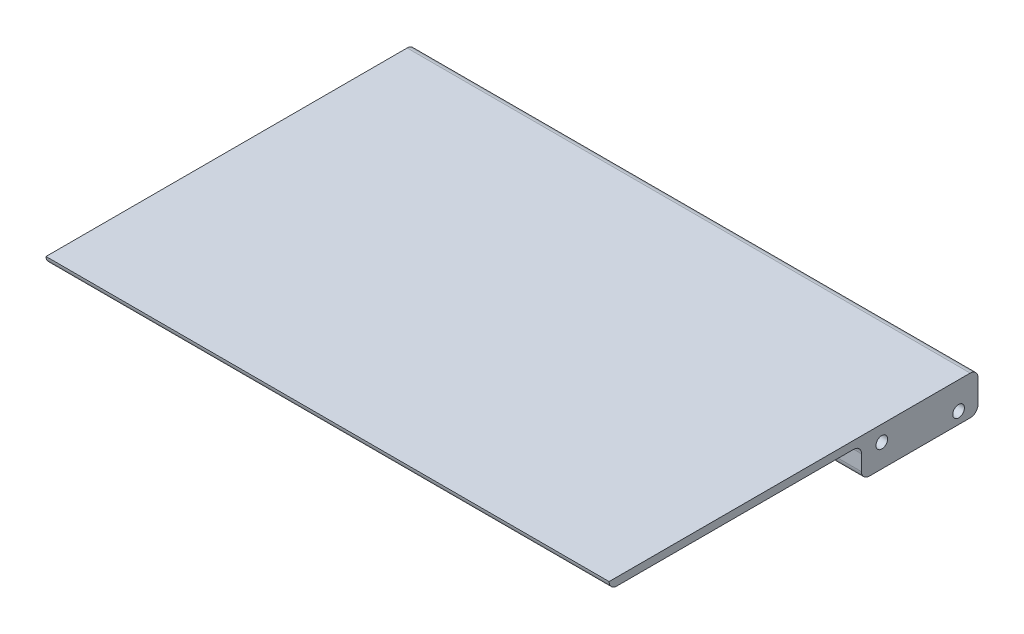
ISO-10303-21;
HEADER;
FILE_DESCRIPTION(('STEP AP214'),'2;1');
FILE_NAME('part.step','',(''),(''),'','','');
FILE_SCHEMA(('AUTOMOTIVE_DESIGN { 1 0 10303 214 1 1 1 1 }'));
ENDSEC;
DATA;
#1=APPLICATION_CONTEXT('core data for automotive mechanical design processes');
#2=APPLICATION_PROTOCOL_DEFINITION('international standard','automotive_design',2000,#1);
#3=PRODUCT_CONTEXT('',#1,'mechanical');
#4=PRODUCT('Part','Part','',(#3));
#5=PRODUCT_RELATED_PRODUCT_CATEGORY('part','',(#4));
#6=PRODUCT_DEFINITION_FORMATION('','',#4);
#7=PRODUCT_DEFINITION_CONTEXT('part definition',#1,'design');
#8=PRODUCT_DEFINITION('design','',#6,#7);
#9=PRODUCT_DEFINITION_SHAPE('','',#8);
#10=(LENGTH_UNIT() NAMED_UNIT(*) SI_UNIT(.MILLI.,.METRE.));
#11=(NAMED_UNIT(*) PLANE_ANGLE_UNIT() SI_UNIT($,.RADIAN.));
#12=(NAMED_UNIT(*) SI_UNIT($,.STERADIAN.) SOLID_ANGLE_UNIT());
#13=UNCERTAINTY_MEASURE_WITH_UNIT(LENGTH_MEASURE(1.E-05),#10,'distance_accuracy_value','');
#14=(GEOMETRIC_REPRESENTATION_CONTEXT(3) GLOBAL_UNCERTAINTY_ASSIGNED_CONTEXT((#13)) GLOBAL_UNIT_ASSIGNED_CONTEXT((#10,
#11,#12)) REPRESENTATION_CONTEXT('',''));
#15=CARTESIAN_POINT('',(0.,0.,0.));
#16=DIRECTION('',(0.,0.,1.));
#17=DIRECTION('',(1.,0.,0.));
#18=AXIS2_PLACEMENT_3D('',#15,#16,#17);
#19=CARTESIAN_POINT('',(72.5,2.,-47.5));
#20=DIRECTION('',(0.,0.,1.));
#21=DIRECTION('',(1.,0.,0.));
#22=AXIS2_PLACEMENT_3D('',#19,#20,#21);
#23=PLANE('',#22);
#24=DIRECTION('',(1.,0.,0.));
#25=VECTOR('',#24,1.);
#26=CARTESIAN_POINT('',(-72.5,-5.99999999999999,-47.5));
#27=LINE('',#26,#25);
#28=CARTESIAN_POINT('',(72.5,-5.99999999999999,-47.5));
#29=VERTEX_POINT('',#28);
#30=CARTESIAN_POINT('',(62.5,-5.99999999999999,-47.5));
#31=VERTEX_POINT('',#30);
#32=EDGE_CURVE('E201',#29,#31,#27,.F.);
#33=ORIENTED_EDGE('',*,*,#32,.T.);
#34=DIRECTION('',(0.,1.,0.));
#35=VECTOR('',#34,1.);
#36=CARTESIAN_POINT('',(62.5,2.,-47.5));
#37=LINE('',#36,#35);
#38=CARTESIAN_POINT('',(62.5,0.,-47.5));
#39=VERTEX_POINT('',#38);
#40=EDGE_CURVE('E248',#31,#39,#37,.T.);
#41=ORIENTED_EDGE('',*,*,#40,.T.);
#42=DIRECTION('',(-1.,0.,0.));
#43=VECTOR('',#42,1.);
#44=CARTESIAN_POINT('',(72.5,0.,-47.5));
#45=LINE('',#44,#43);
#46=CARTESIAN_POINT('',(72.5,0.,-47.5));
#47=VERTEX_POINT('',#46);
#48=EDGE_CURVE('E189',#39,#47,#45,.F.);
#49=ORIENTED_EDGE('',*,*,#48,.T.);
#50=DIRECTION('',(0.,-1.,0.));
#51=VECTOR('',#50,1.);
#52=CARTESIAN_POINT('',(72.5,2.,-47.5));
#53=LINE('',#52,#51);
#54=EDGE_CURVE('E294',#47,#29,#53,.T.);
#55=ORIENTED_EDGE('',*,*,#54,.T.);
#56=EDGE_LOOP('',(#33,#41,#49,#55));
#57=FACE_BOUND('',#56,.T.);
#58=ADVANCED_FACE('F44',(#57),#23,.F.);
#59=CARTESIAN_POINT('',(-72.5,-7.99999999999999,-47.5));
#60=DIRECTION('',(0.,-1.,0.));
#61=DIRECTION('',(0.,0.,-1.));
#62=AXIS2_PLACEMENT_3D('',#59,#60,#61);
#63=PLANE('',#62);
#64=DIRECTION('',(0.,0.,1.));
#65=VECTOR('',#64,1.);
#66=CARTESIAN_POINT('',(62.5,-7.99999999999999,-73.6343650991508));
#67=LINE('',#66,#65);
#68=CARTESIAN_POINT('',(62.5,-8.,-45.5));
#69=VERTEX_POINT('',#68);
#70=CARTESIAN_POINT('',(62.5000000000001,-8.,-19.5));
#71=VERTEX_POINT('',#70);
#72=EDGE_CURVE('E332',#69,#71,#67,.T.);
#73=ORIENTED_EDGE('',*,*,#72,.F.);
#74=DIRECTION('',(1.,0.,0.));
#75=VECTOR('',#74,1.);
#76=CARTESIAN_POINT('',(72.5,-7.99999999999999,-45.5));
#77=LINE('',#76,#75);
#78=CARTESIAN_POINT('',(72.5,-7.99999999999999,-45.5));
#79=VERTEX_POINT('',#78);
#80=EDGE_CURVE('E206',#69,#79,#77,.T.);
#81=ORIENTED_EDGE('',*,*,#80,.T.);
#82=DIRECTION('',(0.,0.,-1.));
#83=VECTOR('',#82,1.);
#84=CARTESIAN_POINT('',(72.5,-7.99999999999999,-47.5));
#85=LINE('',#84,#83);
#86=CARTESIAN_POINT('',(72.5,-8.,-19.5));
#87=VERTEX_POINT('',#86);
#88=EDGE_CURVE('E271',#87,#79,#85,.T.);
#89=ORIENTED_EDGE('',*,*,#88,.F.);
#90=DIRECTION('',(1.,0.,0.));
#91=VECTOR('',#90,1.);
#92=CARTESIAN_POINT('',(-72.5,-8.,-19.5));
#93=LINE('',#92,#91);
#94=EDGE_CURVE('E199',#87,#71,#93,.F.);
#95=ORIENTED_EDGE('',*,*,#94,.T.);
#96=EDGE_LOOP('',(#73,#81,#89,#95));
#97=FACE_BOUND('',#96,.T.);
#98=ADVANCED_FACE('F335',(#97),#63,.T.);
#99=CARTESIAN_POINT('',(-72.5,-8.,-17.5));
#100=DIRECTION('',(0.,0.,1.));
#101=DIRECTION('',(1.,0.,0.));
#102=AXIS2_PLACEMENT_3D('',#99,#100,#101);
#103=PLANE('',#102);
#104=DIRECTION('',(0.,1.,0.));
#105=VECTOR('',#104,1.);
#106=CARTESIAN_POINT('',(62.5000000000001,-8.,-17.5));
#107=LINE('',#106,#105);
#108=CARTESIAN_POINT('',(62.5000000000001,-6.,-17.5));
#109=VERTEX_POINT('',#108);
#110=CARTESIAN_POINT('',(62.5,-2.,-17.5));
#111=VERTEX_POINT('',#110);
#112=EDGE_CURVE('E242',#109,#111,#107,.T.);
#113=ORIENTED_EDGE('',*,*,#112,.F.);
#114=DIRECTION('',(1.,0.,0.));
#115=VECTOR('',#114,1.);
#116=CARTESIAN_POINT('',(-72.5,-6.,-17.5));
#117=LINE('',#116,#115);
#118=CARTESIAN_POINT('',(72.5,-6.,-17.5));
#119=VERTEX_POINT('',#118);
#120=EDGE_CURVE('E214',#109,#119,#117,.T.);
#121=ORIENTED_EDGE('',*,*,#120,.T.);
#122=DIRECTION('',(0.,-1.,0.));
#123=VECTOR('',#122,1.);
#124=CARTESIAN_POINT('',(72.5,-8.,-17.5));
#125=LINE('',#124,#123);
#126=CARTESIAN_POINT('',(72.5,-2.,-17.5));
#127=VERTEX_POINT('',#126);
#128=EDGE_CURVE('E265',#127,#119,#125,.T.);
#129=ORIENTED_EDGE('',*,*,#128,.F.);
#130=DIRECTION('',(1.,0.,0.));
#131=VECTOR('',#130,1.);
#132=CARTESIAN_POINT('',(-72.5,-2.,-17.5));
#133=LINE('',#132,#131);
#134=EDGE_CURVE('E211',#127,#111,#133,.F.);
#135=ORIENTED_EDGE('',*,*,#134,.T.);
#136=EDGE_LOOP('',(#113,#121,#129,#135));
#137=FACE_BOUND('',#136,.T.);
#138=ADVANCED_FACE('F371',(#137),#103,.T.);
#139=CARTESIAN_POINT('',(-72.5,-2.04381177740778,-22.7196827327617));
#140=DIRECTION('',(1.,0.,0.));
#141=DIRECTION('',(0.,0.,-1.));
#142=AXIS2_PLACEMENT_3D('',#139,#140,#141);
#143=CYLINDRICAL_SURFACE('',#142,1.5);
#144=CARTESIAN_POINT('',(62.5000000000001,-2.04381177740778,-22.7196827327617));
#145=DIRECTION('',(1.,0.,0.));
#146=DIRECTION('',(0.,1.,0.));
#147=AXIS2_PLACEMENT_3D('',#144,#145,#146);
#148=CIRCLE('',#147,1.5);
#149=CARTESIAN_POINT('',(62.5000000000001,-0.543811777407773,-22.7196827327617));
#150=VERTEX_POINT('',#149);
#151=EDGE_CURVE('E191',#150,#150,#148,.F.);
#152=ORIENTED_EDGE('',*,*,#151,.T.);
#153=EDGE_LOOP('',(#152));
#154=FACE_BOUND('',#153,.T.);
#155=CARTESIAN_POINT('',(72.5,-2.04381177740778,-22.7196827327617));
#156=DIRECTION('',(1.,0.,0.));
#157=DIRECTION('',(0.,0.,-1.));
#158=AXIS2_PLACEMENT_3D('',#155,#156,#157);
#159=CIRCLE('',#158,1.5);
#160=CARTESIAN_POINT('',(72.5,-2.04381177740778,-24.2196827327617));
#161=VERTEX_POINT('',#160);
#162=EDGE_CURVE('E259',#161,#161,#159,.T.);
#163=ORIENTED_EDGE('',*,*,#162,.T.);
#164=EDGE_LOOP('',(#163));
#165=FACE_BOUND('',#164,.T.);
#166=ADVANCED_FACE('F468',(#154,#165),#143,.F.);
#167=CARTESIAN_POINT('',(-72.5,-5.,-42.5));
#168=DIRECTION('',(1.,0.,0.));
#169=DIRECTION('',(0.,0.,-1.));
#170=AXIS2_PLACEMENT_3D('',#167,#168,#169);
#171=CYLINDRICAL_SURFACE('',#170,1.5);
#172=CARTESIAN_POINT('',(62.5000000000001,-5.,-42.5));
#173=DIRECTION('',(1.,0.,0.));
#174=DIRECTION('',(0.,1.,0.));
#175=AXIS2_PLACEMENT_3D('',#172,#173,#174);
#176=CIRCLE('',#175,1.5);
#177=CARTESIAN_POINT('',(62.5000000000001,-3.49999999999999,-42.5));
#178=VERTEX_POINT('',#177);
#179=EDGE_CURVE('E251',#178,#178,#176,.F.);
#180=ORIENTED_EDGE('',*,*,#179,.T.);
#181=EDGE_LOOP('',(#180));
#182=FACE_BOUND('',#181,.T.);
#183=CARTESIAN_POINT('',(72.5,-5.,-42.5));
#184=DIRECTION('',(1.,0.,0.));
#185=DIRECTION('',(0.,0.,-1.));
#186=AXIS2_PLACEMENT_3D('',#183,#184,#185);
#187=CIRCLE('',#186,1.5);
#188=CARTESIAN_POINT('',(72.5,-5.,-44.));
#189=VERTEX_POINT('',#188);
#190=EDGE_CURVE('E190',#189,#189,#187,.T.);
#191=ORIENTED_EDGE('',*,*,#190,.T.);
#192=EDGE_LOOP('',(#191));
#193=FACE_BOUND('',#192,.T.);
#194=ADVANCED_FACE('F479',(#182,#193),#171,.F.);
#195=CARTESIAN_POINT('',(-72.5,-5.99999999999999,-45.5));
#196=DIRECTION('',(-1.,0.,0.));
#197=DIRECTION('',(0.,0.,1.));
#198=AXIS2_PLACEMENT_3D('',#195,#196,#197);
#199=CYLINDRICAL_SURFACE('',#198,2.);
#200=CARTESIAN_POINT('',(62.5,-5.99999999999999,-45.5));
#201=DIRECTION('',(1.,0.,0.));
#202=DIRECTION('',(0.,1.,0.));
#203=AXIS2_PLACEMENT_3D('',#200,#201,#202);
#204=CIRCLE('',#203,2.);
#205=EDGE_CURVE('E246',#31,#69,#204,.F.);
#206=ORIENTED_EDGE('',*,*,#205,.F.);
#207=ORIENTED_EDGE('',*,*,#32,.F.);
#208=CARTESIAN_POINT('',(72.5,-5.99999999999999,-45.5));
#209=DIRECTION('',(-1.,0.,0.));
#210=DIRECTION('',(0.,0.,1.));
#211=AXIS2_PLACEMENT_3D('',#208,#209,#210);
#212=CIRCLE('',#211,2.);
#213=EDGE_CURVE('E299',#79,#29,#212,.F.);
#214=ORIENTED_EDGE('',*,*,#213,.F.);
#215=ORIENTED_EDGE('',*,*,#80,.F.);
#216=EDGE_LOOP('',(#206,#207,#214,#215));
#217=FACE_BOUND('',#216,.T.);
#218=ADVANCED_FACE('F326',(#217),#199,.T.);
#219=CARTESIAN_POINT('',(-72.5,-6.,-19.5));
#220=DIRECTION('',(1.,0.,0.));
#221=DIRECTION('',(0.,0.,-1.));
#222=AXIS2_PLACEMENT_3D('',#219,#220,#221);
#223=CYLINDRICAL_SURFACE('',#222,2.);
#224=CARTESIAN_POINT('',(62.5000000000001,-6.,-19.5));
#225=DIRECTION('',(1.,0.,0.));
#226=DIRECTION('',(0.,1.,0.));
#227=AXIS2_PLACEMENT_3D('',#224,#225,#226);
#228=CIRCLE('',#227,2.);
#229=EDGE_CURVE('E244',#71,#109,#228,.F.);
#230=ORIENTED_EDGE('',*,*,#229,.F.);
#231=ORIENTED_EDGE('',*,*,#94,.F.);
#232=CARTESIAN_POINT('',(72.5,-6.,-19.5));
#233=DIRECTION('',(-1.,0.,0.));
#234=DIRECTION('',(0.,0.,1.));
#235=AXIS2_PLACEMENT_3D('',#232,#233,#234);
#236=CIRCLE('',#235,2.);
#237=EDGE_CURVE('E297',#119,#87,#236,.F.);
#238=ORIENTED_EDGE('',*,*,#237,.F.);
#239=ORIENTED_EDGE('',*,*,#120,.F.);
#240=EDGE_LOOP('',(#230,#231,#238,#239));
#241=FACE_BOUND('',#240,.T.);
#242=ADVANCED_FACE('F357',(#241),#223,.T.);
#243=CARTESIAN_POINT('',(0.,-2.,-15.5));
#244=DIRECTION('',(1.,0.,0.));
#245=DIRECTION('',(0.,0.,-1.));
#246=AXIS2_PLACEMENT_3D('',#243,#244,#245);
#247=CYLINDRICAL_SURFACE('',#246,2.);
#248=DIRECTION('',(1.,0.,0.));
#249=VECTOR('',#248,1.);
#250=CARTESIAN_POINT('',(0.,0.,-15.5));
#251=LINE('',#250,#249);
#252=CARTESIAN_POINT('',(62.5,0.,-15.5));
#253=VERTEX_POINT('',#252);
#254=CARTESIAN_POINT('',(72.5,0.,-15.5));
#255=VERTEX_POINT('',#254);
#256=EDGE_CURVE('E305',#253,#255,#251,.T.);
#257=ORIENTED_EDGE('',*,*,#256,.F.);
#258=CARTESIAN_POINT('',(62.5,-2.,-15.5));
#259=DIRECTION('',(1.,0.,0.));
#260=DIRECTION('',(0.,1.,0.));
#261=AXIS2_PLACEMENT_3D('',#258,#259,#260);
#262=CIRCLE('',#261,2.);
#263=EDGE_CURVE('E11',#253,#111,#262,.F.);
#264=ORIENTED_EDGE('',*,*,#263,.T.);
#265=ORIENTED_EDGE('',*,*,#134,.F.);
#266=CARTESIAN_POINT('',(72.5,-2.,-15.5));
#267=DIRECTION('',(-1.,0.,0.));
#268=DIRECTION('',(0.,0.,1.));
#269=AXIS2_PLACEMENT_3D('',#266,#267,#268);
#270=CIRCLE('',#269,2.);
#271=EDGE_CURVE('E218',#255,#127,#270,.T.);
#272=ORIENTED_EDGE('',*,*,#271,.F.);
#273=EDGE_LOOP('',(#257,#264,#265,#272));
#274=FACE_BOUND('',#273,.T.);
#275=ADVANCED_FACE('F362',(#274),#247,.F.);
#276=CARTESIAN_POINT('',(-72.5,2.,47.5));
#277=DIRECTION('',(1.,0.,0.));
#278=DIRECTION('',(0.,0.,-1.));
#279=AXIS2_PLACEMENT_3D('',#276,#277,#278);
#280=PLANE('',#279);
#281=DIRECTION('',(0.,0.,1.));
#282=VECTOR('',#281,1.);
#283=CARTESIAN_POINT('',(-72.5,0.,47.5));
#284=LINE('',#283,#282);
#285=CARTESIAN_POINT('',(-72.5,0.,-15.5));
#286=VERTEX_POINT('',#285);
#287=CARTESIAN_POINT('',(-72.5,0.,45.5));
#288=VERTEX_POINT('',#287);
#289=EDGE_CURVE('E274',#286,#288,#284,.T.);
#290=ORIENTED_EDGE('',*,*,#289,.T.);
#291=CARTESIAN_POINT('',(-72.5,2.,45.5));
#292=DIRECTION('',(1.,0.,0.));
#293=DIRECTION('',(0.,0.,-1.));
#294=AXIS2_PLACEMENT_3D('',#291,#292,#293);
#295=CIRCLE('',#294,2.);
#296=CARTESIAN_POINT('',(-72.5,2.,47.5));
#297=VERTEX_POINT('',#296);
#298=EDGE_CURVE('E314',#288,#297,#295,.F.);
#299=ORIENTED_EDGE('',*,*,#298,.T.);
#300=DIRECTION('',(0.,0.,1.));
#301=VECTOR('',#300,1.);
#302=CARTESIAN_POINT('',(-72.5,2.,47.5));
#303=LINE('',#302,#301);
#304=CARTESIAN_POINT('',(-72.5,2.,-45.5));
#305=VERTEX_POINT('',#304);
#306=EDGE_CURVE('E279',#305,#297,#303,.T.);
#307=ORIENTED_EDGE('',*,*,#306,.F.);
#308=CARTESIAN_POINT('',(-72.5,0.,-45.5));
#309=DIRECTION('',(1.,0.,0.));
#310=DIRECTION('',(0.,0.,-1.));
#311=AXIS2_PLACEMENT_3D('',#308,#309,#310);
#312=CIRCLE('',#311,2.);
#313=CARTESIAN_POINT('',(-72.5,0.,-47.5));
#314=VERTEX_POINT('',#313);
#315=EDGE_CURVE('E67',#305,#314,#312,.F.);
#316=ORIENTED_EDGE('',*,*,#315,.T.);
#317=DIRECTION('',(0.,-1.,0.));
#318=VECTOR('',#317,1.);
#319=CARTESIAN_POINT('',(-72.5,2.,-47.5));
#320=LINE('',#319,#318);
#321=CARTESIAN_POINT('',(-72.5,-5.99999999999999,-47.5));
#322=VERTEX_POINT('',#321);
#323=EDGE_CURVE('E196',#314,#322,#320,.T.);
#324=ORIENTED_EDGE('',*,*,#323,.T.);
#325=CARTESIAN_POINT('',(-72.5,-5.99999999999999,-45.5));
#326=DIRECTION('',(1.,0.,0.));
#327=DIRECTION('',(0.,0.,-1.));
#328=AXIS2_PLACEMENT_3D('',#325,#326,#327);
#329=CIRCLE('',#328,2.);
#330=CARTESIAN_POINT('',(-72.5,-7.99999999999999,-45.5));
#331=VERTEX_POINT('',#330);
#332=EDGE_CURVE('E311',#322,#331,#329,.F.);
#333=ORIENTED_EDGE('',*,*,#332,.T.);
#334=DIRECTION('',(0.,0.,-1.));
#335=VECTOR('',#334,1.);
#336=CARTESIAN_POINT('',(-72.5,-7.99999999999999,-47.5));
#337=LINE('',#336,#335);
#338=CARTESIAN_POINT('',(-72.5,-8.,-19.5));
#339=VERTEX_POINT('',#338);
#340=EDGE_CURVE('E270',#339,#331,#337,.T.);
#341=ORIENTED_EDGE('',*,*,#340,.F.);
#342=CARTESIAN_POINT('',(-72.5,-6.,-19.5));
#343=DIRECTION('',(1.,0.,0.));
#344=DIRECTION('',(0.,0.,-1.));
#345=AXIS2_PLACEMENT_3D('',#342,#343,#344);
#346=CIRCLE('',#345,2.);
#347=CARTESIAN_POINT('',(-72.5,-6.,-17.5));
#348=VERTEX_POINT('',#347);
#349=EDGE_CURVE('E309',#339,#348,#346,.F.);
#350=ORIENTED_EDGE('',*,*,#349,.T.);
#351=DIRECTION('',(0.,-1.,0.));
#352=VECTOR('',#351,1.);
#353=CARTESIAN_POINT('',(-72.5,-8.,-17.5));
#354=LINE('',#353,#352);
#355=CARTESIAN_POINT('',(-72.5,-2.,-17.5));
#356=VERTEX_POINT('',#355);
#357=EDGE_CURVE('E268',#356,#348,#354,.T.);
#358=ORIENTED_EDGE('',*,*,#357,.F.);
#359=CARTESIAN_POINT('',(-72.5,-2.,-15.5));
#360=DIRECTION('',(1.,0.,0.));
#361=DIRECTION('',(0.,0.,-1.));
#362=AXIS2_PLACEMENT_3D('',#359,#360,#361);
#363=CIRCLE('',#362,2.);
#364=EDGE_CURVE('E220',#356,#286,#363,.T.);
#365=ORIENTED_EDGE('',*,*,#364,.T.);
#366=EDGE_LOOP('',(#290,#299,#307,#316,#324,#333,#341,#350,#358,#365));
#367=FACE_BOUND('',#366,.T.);
#368=CARTESIAN_POINT('',(-72.5,-5.,-42.5));
#369=DIRECTION('',(1.,0.,0.));
#370=DIRECTION('',(0.,0.,-1.));
#371=AXIS2_PLACEMENT_3D('',#368,#369,#370);
#372=CIRCLE('',#371,1.5);
#373=CARTESIAN_POINT('',(-72.5,-5.,-44.));
#374=VERTEX_POINT('',#373);
#375=EDGE_CURVE('E256',#374,#374,#372,.T.);
#376=ORIENTED_EDGE('',*,*,#375,.T.);
#377=EDGE_LOOP('',(#376));
#378=FACE_BOUND('',#377,.T.);
#379=CARTESIAN_POINT('',(-72.5,-2.04381177740778,-22.7196827327617));
#380=DIRECTION('',(1.,0.,0.));
#381=DIRECTION('',(0.,0.,-1.));
#382=AXIS2_PLACEMENT_3D('',#379,#380,#381);
#383=CIRCLE('',#382,1.5);
#384=CARTESIAN_POINT('',(-72.5,-2.04381177740778,-24.2196827327617));
#385=VERTEX_POINT('',#384);
#386=EDGE_CURVE('E262',#385,#385,#383,.T.);
#387=ORIENTED_EDGE('',*,*,#386,.T.);
#388=EDGE_LOOP('',(#387));
#389=FACE_BOUND('',#388,.T.);
#390=ADVANCED_FACE('F352',(#367,#378,#389),#280,.F.);
#391=CARTESIAN_POINT('',(72.5,2.,47.5));
#392=DIRECTION('',(-1.,0.,0.));
#393=DIRECTION('',(0.,0.,1.));
#394=AXIS2_PLACEMENT_3D('',#391,#392,#393);
#395=PLANE('',#394);
#396=DIRECTION('',(0.,0.,-1.));
#397=VECTOR('',#396,1.);
#398=CARTESIAN_POINT('',(72.5,2.,47.5));
#399=LINE('',#398,#397);
#400=CARTESIAN_POINT('',(72.5,2.,47.5));
#401=VERTEX_POINT('',#400);
#402=CARTESIAN_POINT('',(72.5,2.,-45.5));
#403=VERTEX_POINT('',#402);
#404=EDGE_CURVE('E286',#401,#403,#399,.T.);
#405=ORIENTED_EDGE('',*,*,#404,.F.);
#406=CARTESIAN_POINT('',(72.5,2.,45.5));
#407=DIRECTION('',(-1.,0.,0.));
#408=DIRECTION('',(0.,0.,1.));
#409=AXIS2_PLACEMENT_3D('',#406,#407,#408);
#410=CIRCLE('',#409,2.);
#411=CARTESIAN_POINT('',(72.5,0.,45.5));
#412=VERTEX_POINT('',#411);
#413=EDGE_CURVE('E303',#401,#412,#410,.F.);
#414=ORIENTED_EDGE('',*,*,#413,.T.);
#415=DIRECTION('',(0.,0.,-1.));
#416=VECTOR('',#415,1.);
#417=CARTESIAN_POINT('',(72.5,0.,47.5));
#418=LINE('',#417,#416);
#419=EDGE_CURVE('E283',#412,#255,#418,.T.);
#420=ORIENTED_EDGE('',*,*,#419,.T.);
#421=ORIENTED_EDGE('',*,*,#271,.T.);
#422=ORIENTED_EDGE('',*,*,#128,.T.);
#423=ORIENTED_EDGE('',*,*,#237,.T.);
#424=ORIENTED_EDGE('',*,*,#88,.T.);
#425=ORIENTED_EDGE('',*,*,#213,.T.);
#426=ORIENTED_EDGE('',*,*,#54,.F.);
#427=CARTESIAN_POINT('',(72.5,0.,-45.5));
#428=DIRECTION('',(-1.,0.,0.));
#429=DIRECTION('',(0.,0.,1.));
#430=AXIS2_PLACEMENT_3D('',#427,#428,#429);
#431=CIRCLE('',#430,2.);
#432=EDGE_CURVE('E301',#47,#403,#431,.F.);
#433=ORIENTED_EDGE('',*,*,#432,.T.);
#434=EDGE_LOOP('',(#405,#414,#420,#421,#422,#423,#424,#425,#426,#433));
#435=FACE_BOUND('',#434,.T.);
#436=ORIENTED_EDGE('',*,*,#190,.F.);
#437=EDGE_LOOP('',(#436));
#438=FACE_BOUND('',#437,.T.);
#439=ORIENTED_EDGE('',*,*,#162,.F.);
#440=EDGE_LOOP('',(#439));
#441=FACE_BOUND('',#440,.T.);
#442=ADVANCED_FACE('F377',(#435,#438,#441),#395,.F.);
#443=CARTESIAN_POINT('',(-62.5,0.,-47.5));
#444=VERTEX_POINT('',#443);
#445=EDGE_CURVE('E188',#314,#444,#45,.F.);
#446=ORIENTED_EDGE('',*,*,#445,.T.);
#447=DIRECTION('',(0.,-1.,0.));
#448=VECTOR('',#447,1.);
#449=CARTESIAN_POINT('',(-62.5,2.,-47.5));
#450=LINE('',#449,#448);
#451=CARTESIAN_POINT('',(-62.5,-5.99999999999999,-47.5));
#452=VERTEX_POINT('',#451);
#453=EDGE_CURVE('E162',#444,#452,#450,.T.);
#454=ORIENTED_EDGE('',*,*,#453,.T.);
#455=EDGE_CURVE('E316',#452,#322,#27,.F.);
#456=ORIENTED_EDGE('',*,*,#455,.T.);
#457=ORIENTED_EDGE('',*,*,#323,.F.);
#458=EDGE_LOOP('',(#446,#454,#456,#457));
#459=FACE_BOUND('',#458,.T.);
#460=ADVANCED_FACE('F194',(#459),#23,.F.);
#461=CARTESIAN_POINT('',(0.,2.,0.));
#462=DIRECTION('',(0.,1.,0.));
#463=DIRECTION('',(0.,0.,1.));
#464=AXIS2_PLACEMENT_3D('',#461,#462,#463);
#465=PLANE('',#464);
#466=ORIENTED_EDGE('',*,*,#404,.T.);
#467=DIRECTION('',(-1.,0.,0.));
#468=VECTOR('',#467,1.);
#469=CARTESIAN_POINT('',(-72.5,2.,-45.5));
#470=LINE('',#469,#468);
#471=EDGE_CURVE('E315',#403,#305,#470,.T.);
#472=ORIENTED_EDGE('',*,*,#471,.T.);
#473=ORIENTED_EDGE('',*,*,#306,.T.);
#474=DIRECTION('',(1.,0.,0.));
#475=VECTOR('',#474,1.);
#476=CARTESIAN_POINT('',(72.5,2.,47.5));
#477=LINE('',#476,#475);
#478=EDGE_CURVE('E282',#297,#401,#477,.T.);
#479=ORIENTED_EDGE('',*,*,#478,.T.);
#480=EDGE_LOOP('',(#466,#472,#473,#479));
#481=FACE_BOUND('',#480,.T.);
#482=ADVANCED_FACE('F376',(#481),#465,.T.);
#483=CARTESIAN_POINT('',(0.,0.,0.));
#484=DIRECTION('',(0.,1.,0.));
#485=DIRECTION('',(0.,0.,1.));
#486=AXIS2_PLACEMENT_3D('',#483,#484,#485);
#487=PLANE('',#486);
#488=CARTESIAN_POINT('',(-62.5,0.,-15.5));
#489=VERTEX_POINT('',#488);
#490=EDGE_CURVE('E181',#286,#489,#251,.T.);
#491=ORIENTED_EDGE('',*,*,#490,.T.);
#492=DIRECTION('',(0.,0.,-1.));
#493=VECTOR('',#492,1.);
#494=CARTESIAN_POINT('',(-62.5,0.,-73.6343650991507));
#495=LINE('',#494,#493);
#496=EDGE_CURVE('E59',#489,#444,#495,.T.);
#497=ORIENTED_EDGE('',*,*,#496,.T.);
#498=DIRECTION('',(1.,0.,0.));
#499=VECTOR('',#498,1.);
#500=CARTESIAN_POINT('',(0.,0.,-47.5));
#501=LINE('',#500,#499);
#502=EDGE_CURVE('E177',#444,#39,#501,.T.);
#503=ORIENTED_EDGE('',*,*,#502,.T.);
#504=DIRECTION('',(0.,0.,1.));
#505=VECTOR('',#504,1.);
#506=CARTESIAN_POINT('',(62.5,0.,-73.6343650991507));
#507=LINE('',#506,#505);
#508=EDGE_CURVE('E183',#39,#253,#507,.T.);
#509=ORIENTED_EDGE('',*,*,#508,.T.);
#510=ORIENTED_EDGE('',*,*,#256,.T.);
#511=ORIENTED_EDGE('',*,*,#419,.F.);
#512=DIRECTION('',(1.,0.,0.));
#513=VECTOR('',#512,1.);
#514=CARTESIAN_POINT('',(0.,0.,45.5));
#515=LINE('',#514,#513);
#516=EDGE_CURVE('E307',#412,#288,#515,.F.);
#517=ORIENTED_EDGE('',*,*,#516,.T.);
#518=ORIENTED_EDGE('',*,*,#289,.F.);
#519=EDGE_LOOP('',(#491,#497,#503,#509,#510,#511,#517,#518));
#520=FACE_BOUND('',#519,.T.);
#521=ADVANCED_FACE('F175',(#520),#487,.F.);
#522=DIRECTION('',(0.,0.,-1.));
#523=VECTOR('',#522,1.);
#524=CARTESIAN_POINT('',(-62.5,-7.99999999999999,-73.6343650991508));
#525=LINE('',#524,#523);
#526=CARTESIAN_POINT('',(-62.5,-8.,-19.5));
#527=VERTEX_POINT('',#526);
#528=CARTESIAN_POINT('',(-62.5,-8.,-45.5));
#529=VERTEX_POINT('',#528);
#530=EDGE_CURVE('E338',#527,#529,#525,.T.);
#531=ORIENTED_EDGE('',*,*,#530,.F.);
#532=EDGE_CURVE('E197',#527,#339,#93,.F.);
#533=ORIENTED_EDGE('',*,*,#532,.T.);
#534=ORIENTED_EDGE('',*,*,#340,.T.);
#535=EDGE_CURVE('E207',#331,#529,#77,.T.);
#536=ORIENTED_EDGE('',*,*,#535,.T.);
#537=EDGE_LOOP('',(#531,#533,#534,#536));
#538=FACE_BOUND('',#537,.T.);
#539=ADVANCED_FACE('F348',(#538),#63,.T.);
#540=DIRECTION('',(0.,-1.,0.));
#541=VECTOR('',#540,1.);
#542=CARTESIAN_POINT('',(-62.5,-8.,-17.5));
#543=LINE('',#542,#541);
#544=CARTESIAN_POINT('',(-62.5,-2.,-17.5));
#545=VERTEX_POINT('',#544);
#546=CARTESIAN_POINT('',(-62.5,-6.,-17.5));
#547=VERTEX_POINT('',#546);
#548=EDGE_CURVE('E182',#545,#547,#543,.T.);
#549=ORIENTED_EDGE('',*,*,#548,.F.);
#550=EDGE_CURVE('E210',#545,#356,#133,.F.);
#551=ORIENTED_EDGE('',*,*,#550,.T.);
#552=ORIENTED_EDGE('',*,*,#357,.T.);
#553=EDGE_CURVE('E215',#348,#547,#117,.T.);
#554=ORIENTED_EDGE('',*,*,#553,.T.);
#555=EDGE_LOOP('',(#549,#551,#552,#554));
#556=FACE_BOUND('',#555,.T.);
#557=ADVANCED_FACE('F227',(#556),#103,.T.);
#558=CARTESIAN_POINT('',(-62.5,-2.04381177740778,-22.7196827327617));
#559=DIRECTION('',(-1.,0.,0.));
#560=DIRECTION('',(0.,-1.,0.));
#561=AXIS2_PLACEMENT_3D('',#558,#559,#560);
#562=CIRCLE('',#561,1.5);
#563=CARTESIAN_POINT('',(-62.5,-3.54381177740778,-22.7196827327617));
#564=VERTEX_POINT('',#563);
#565=EDGE_CURVE('E239',#564,#564,#562,.F.);
#566=ORIENTED_EDGE('',*,*,#565,.T.);
#567=EDGE_LOOP('',(#566));
#568=FACE_BOUND('',#567,.T.);
#569=ORIENTED_EDGE('',*,*,#386,.F.);
#570=EDGE_LOOP('',(#569));
#571=FACE_BOUND('',#570,.T.);
#572=ADVANCED_FACE('F482',(#568,#571),#143,.F.);
#573=CARTESIAN_POINT('',(-62.5,-5.,-42.5));
#574=DIRECTION('',(-1.,0.,0.));
#575=DIRECTION('',(0.,-1.,0.));
#576=AXIS2_PLACEMENT_3D('',#573,#574,#575);
#577=CIRCLE('',#576,1.5);
#578=CARTESIAN_POINT('',(-62.5,-6.5,-42.5));
#579=VERTEX_POINT('',#578);
#580=EDGE_CURVE('E170',#579,#579,#577,.F.);
#581=ORIENTED_EDGE('',*,*,#580,.T.);
#582=EDGE_LOOP('',(#581));
#583=FACE_BOUND('',#582,.T.);
#584=ORIENTED_EDGE('',*,*,#375,.F.);
#585=EDGE_LOOP('',(#584));
#586=FACE_BOUND('',#585,.T.);
#587=ADVANCED_FACE('F394',(#583,#586),#171,.F.);
#588=CARTESIAN_POINT('',(72.5,2.,45.5));
#589=DIRECTION('',(1.,0.,0.));
#590=DIRECTION('',(0.,0.,-1.));
#591=AXIS2_PLACEMENT_3D('',#588,#589,#590);
#592=CYLINDRICAL_SURFACE('',#591,2.);
#593=ORIENTED_EDGE('',*,*,#298,.F.);
#594=ORIENTED_EDGE('',*,*,#516,.F.);
#595=ORIENTED_EDGE('',*,*,#413,.F.);
#596=ORIENTED_EDGE('',*,*,#478,.F.);
#597=EDGE_LOOP('',(#593,#594,#595,#596));
#598=FACE_BOUND('',#597,.T.);
#599=ADVANCED_FACE('F391',(#598),#592,.T.);
#600=CARTESIAN_POINT('',(0.,0.,-45.5));
#601=DIRECTION('',(1.,0.,0.));
#602=DIRECTION('',(0.,0.,-1.));
#603=AXIS2_PLACEMENT_3D('',#600,#601,#602);
#604=CYLINDRICAL_SURFACE('',#603,2.);
#605=ORIENTED_EDGE('',*,*,#432,.F.);
#606=ORIENTED_EDGE('',*,*,#48,.F.);
#607=ORIENTED_EDGE('',*,*,#502,.F.);
#608=ORIENTED_EDGE('',*,*,#445,.F.);
#609=ORIENTED_EDGE('',*,*,#315,.F.);
#610=ORIENTED_EDGE('',*,*,#471,.F.);
#611=EDGE_LOOP('',(#605,#606,#607,#608,#609,#610));
#612=FACE_BOUND('',#611,.T.);
#613=ADVANCED_FACE('F187',(#612),#604,.T.);
#614=CARTESIAN_POINT('',(-62.5,-5.99999999999999,-45.5));
#615=DIRECTION('',(-1.,0.,0.));
#616=DIRECTION('',(0.,-1.,0.));
#617=AXIS2_PLACEMENT_3D('',#614,#615,#616);
#618=CIRCLE('',#617,2.);
#619=EDGE_CURVE('E166',#529,#452,#618,.F.);
#620=ORIENTED_EDGE('',*,*,#619,.F.);
#621=ORIENTED_EDGE('',*,*,#535,.F.);
#622=ORIENTED_EDGE('',*,*,#332,.F.);
#623=ORIENTED_EDGE('',*,*,#455,.F.);
#624=EDGE_LOOP('',(#620,#621,#622,#623));
#625=FACE_BOUND('',#624,.T.);
#626=ADVANCED_FACE('F346',(#625),#199,.T.);
#627=CARTESIAN_POINT('',(-62.5,-6.,-19.5));
#628=DIRECTION('',(-1.,0.,0.));
#629=DIRECTION('',(0.,-1.,0.));
#630=AXIS2_PLACEMENT_3D('',#627,#628,#629);
#631=CIRCLE('',#630,2.);
#632=EDGE_CURVE('E231',#547,#527,#631,.F.);
#633=ORIENTED_EDGE('',*,*,#632,.F.);
#634=ORIENTED_EDGE('',*,*,#553,.F.);
#635=ORIENTED_EDGE('',*,*,#349,.F.);
#636=ORIENTED_EDGE('',*,*,#532,.F.);
#637=EDGE_LOOP('',(#633,#634,#635,#636));
#638=FACE_BOUND('',#637,.T.);
#639=ADVANCED_FACE('F355',(#638),#223,.T.);
#640=ORIENTED_EDGE('',*,*,#550,.F.);
#641=CARTESIAN_POINT('',(-62.5,-2.,-15.5));
#642=DIRECTION('',(-1.,0.,0.));
#643=DIRECTION('',(0.,-1.,0.));
#644=AXIS2_PLACEMENT_3D('',#641,#642,#643);
#645=CIRCLE('',#644,2.);
#646=EDGE_CURVE('E52',#545,#489,#645,.F.);
#647=ORIENTED_EDGE('',*,*,#646,.T.);
#648=ORIENTED_EDGE('',*,*,#490,.F.);
#649=ORIENTED_EDGE('',*,*,#364,.F.);
#650=EDGE_LOOP('',(#640,#647,#648,#649));
#651=FACE_BOUND('',#650,.T.);
#652=ADVANCED_FACE('F46',(#651),#247,.F.);
#653=CARTESIAN_POINT('',(62.5,193.165936164273,-73.6343650991507));
#654=DIRECTION('',(1.,0.,0.));
#655=DIRECTION('',(0.,1.,0.));
#656=AXIS2_PLACEMENT_3D('',#653,#654,#655);
#657=PLANE('',#656);
#658=ORIENTED_EDGE('',*,*,#179,.F.);
#659=EDGE_LOOP('',(#658));
#660=FACE_BOUND('',#659,.T.);
#661=ORIENTED_EDGE('',*,*,#205,.T.);
#662=ORIENTED_EDGE('',*,*,#72,.T.);
#663=ORIENTED_EDGE('',*,*,#229,.T.);
#664=ORIENTED_EDGE('',*,*,#112,.T.);
#665=ORIENTED_EDGE('',*,*,#263,.F.);
#666=ORIENTED_EDGE('',*,*,#508,.F.);
#667=ORIENTED_EDGE('',*,*,#40,.F.);
#668=EDGE_LOOP('',(#661,#662,#663,#664,#665,#666,#667));
#669=FACE_BOUND('',#668,.T.);
#670=ORIENTED_EDGE('',*,*,#151,.F.);
#671=EDGE_LOOP('',(#670));
#672=FACE_BOUND('',#671,.T.);
#673=ADVANCED_FACE('F330',(#660,#669,#672),#657,.F.);
#674=CARTESIAN_POINT('',(-62.5,193.165936164273,-73.6343650991507));
#675=DIRECTION('',(-1.,0.,0.));
#676=DIRECTION('',(0.,-1.,0.));
#677=AXIS2_PLACEMENT_3D('',#674,#675,#676);
#678=PLANE('',#677);
#679=ORIENTED_EDGE('',*,*,#580,.F.);
#680=EDGE_LOOP('',(#679));
#681=FACE_BOUND('',#680,.T.);
#682=ORIENTED_EDGE('',*,*,#496,.F.);
#683=ORIENTED_EDGE('',*,*,#646,.F.);
#684=ORIENTED_EDGE('',*,*,#548,.T.);
#685=ORIENTED_EDGE('',*,*,#632,.T.);
#686=ORIENTED_EDGE('',*,*,#530,.T.);
#687=ORIENTED_EDGE('',*,*,#619,.T.);
#688=ORIENTED_EDGE('',*,*,#453,.F.);
#689=EDGE_LOOP('',(#682,#683,#684,#685,#686,#687,#688));
#690=FACE_BOUND('',#689,.T.);
#691=ORIENTED_EDGE('',*,*,#565,.F.);
#692=EDGE_LOOP('',(#691));
#693=FACE_BOUND('',#692,.T.);
#694=ADVANCED_FACE('F163',(#681,#690,#693),#678,.F.);
#695=CLOSED_SHELL('',(#58,#98,#138,#166,#194,#218,#242,#275,#390,#442,#460,#482,#521,#539,#557,
#572,#587,#599,#613,#626,#639,#652,#673,#694));
#696=MANIFOLD_SOLID_BREP('B2',#695);
#697=ADVANCED_BREP_SHAPE_REPRESENTATION('',(#18,#696),#14);
#698=SHAPE_DEFINITION_REPRESENTATION(#9,#697);
ENDSEC;
END-ISO-10303-21;
